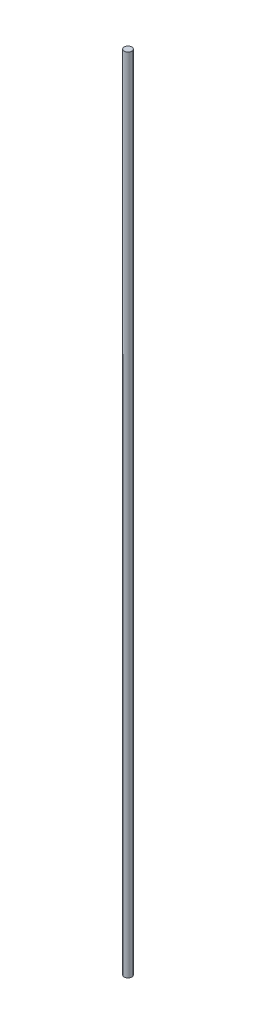
ISO-10303-21;
HEADER;
FILE_DESCRIPTION(('STEP AP214'),'2;1');
FILE_NAME('part.step','',(''),(''),'','','');
FILE_SCHEMA(('AUTOMOTIVE_DESIGN { 1 0 10303 214 1 1 1 1 }'));
ENDSEC;
DATA;
#1=APPLICATION_CONTEXT('core data for automotive mechanical design processes');
#2=APPLICATION_PROTOCOL_DEFINITION('international standard','automotive_design',2000,#1);
#3=PRODUCT_CONTEXT('',#1,'mechanical');
#4=PRODUCT('Part','Part','',(#3));
#5=PRODUCT_RELATED_PRODUCT_CATEGORY('part','',(#4));
#6=PRODUCT_DEFINITION_FORMATION('','',#4);
#7=PRODUCT_DEFINITION_CONTEXT('part definition',#1,'design');
#8=PRODUCT_DEFINITION('design','',#6,#7);
#9=PRODUCT_DEFINITION_SHAPE('','',#8);
#10=(LENGTH_UNIT() NAMED_UNIT(*) SI_UNIT(.MILLI.,.METRE.));
#11=(NAMED_UNIT(*) PLANE_ANGLE_UNIT() SI_UNIT($,.RADIAN.));
#12=(NAMED_UNIT(*) SI_UNIT($,.STERADIAN.) SOLID_ANGLE_UNIT());
#13=UNCERTAINTY_MEASURE_WITH_UNIT(LENGTH_MEASURE(1.E-05),#10,'distance_accuracy_value','');
#14=(GEOMETRIC_REPRESENTATION_CONTEXT(3) GLOBAL_UNCERTAINTY_ASSIGNED_CONTEXT((#13)) GLOBAL_UNIT_ASSIGNED_CONTEXT((#10,
#11,#12)) REPRESENTATION_CONTEXT('',''));
#15=CARTESIAN_POINT('',(0.,0.,0.));
#16=DIRECTION('',(0.,0.,1.));
#17=DIRECTION('',(1.,0.,0.));
#18=AXIS2_PLACEMENT_3D('',#15,#16,#17);
#19=CARTESIAN_POINT('',(0.,2025.,0.));
#20=DIRECTION('',(0.,-1.,0.));
#21=DIRECTION('',(0.,0.,1.));
#22=AXIS2_PLACEMENT_3D('',#19,#20,#21);
#23=CYLINDRICAL_SURFACE('',#22,9.5);
#24=CARTESIAN_POINT('',(0.,2025.,0.));
#25=DIRECTION('',(0.,-1.,0.));
#26=DIRECTION('',(0.,0.,-1.));
#27=AXIS2_PLACEMENT_3D('',#24,#25,#26);
#28=CIRCLE('',#27,9.5);
#29=CARTESIAN_POINT('',(0.,2025.,-9.5));
#30=VERTEX_POINT('',#29);
#31=EDGE_CURVE('E10',#30,#30,#28,.T.);
#32=ORIENTED_EDGE('',*,*,#31,.T.);
#33=EDGE_LOOP('',(#32));
#34=FACE_BOUND('',#33,.T.);
#35=CARTESIAN_POINT('',(0.,0.,0.));
#36=DIRECTION('',(0.,-1.,0.));
#37=DIRECTION('',(0.,0.,-1.));
#38=AXIS2_PLACEMENT_3D('',#35,#36,#37);
#39=CIRCLE('',#38,9.5);
#40=CARTESIAN_POINT('',(0.,0.,-9.5));
#41=VERTEX_POINT('',#40);
#42=EDGE_CURVE('E38',#41,#41,#39,.T.);
#43=ORIENTED_EDGE('',*,*,#42,.F.);
#44=EDGE_LOOP('',(#43));
#45=FACE_BOUND('',#44,.T.);
#46=ADVANCED_FACE('F35',(#34,#45),#23,.T.);
#47=CARTESIAN_POINT('',(0.,2025.,0.));
#48=DIRECTION('',(0.,1.,0.));
#49=DIRECTION('',(0.,0.,-1.));
#50=AXIS2_PLACEMENT_3D('',#47,#48,#49);
#51=PLANE('',#50);
#52=ORIENTED_EDGE('',*,*,#31,.F.);
#53=EDGE_LOOP('',(#52));
#54=FACE_BOUND('',#53,.T.);
#55=ADVANCED_FACE('F50',(#54),#51,.T.);
#56=CARTESIAN_POINT('',(0.,0.,0.));
#57=DIRECTION('',(0.,1.,0.));
#58=DIRECTION('',(0.,0.,-1.));
#59=AXIS2_PLACEMENT_3D('',#56,#57,#58);
#60=PLANE('',#59);
#61=ORIENTED_EDGE('',*,*,#42,.T.);
#62=EDGE_LOOP('',(#61));
#63=FACE_BOUND('',#62,.T.);
#64=ADVANCED_FACE('F47',(#63),#60,.F.);
#65=CLOSED_SHELL('',(#46,#55,#64));
#66=MANIFOLD_SOLID_BREP('B2',#65);
#67=ADVANCED_BREP_SHAPE_REPRESENTATION('',(#18,#66),#14);
#68=SHAPE_DEFINITION_REPRESENTATION(#9,#67);
ENDSEC;
END-ISO-10303-21;
